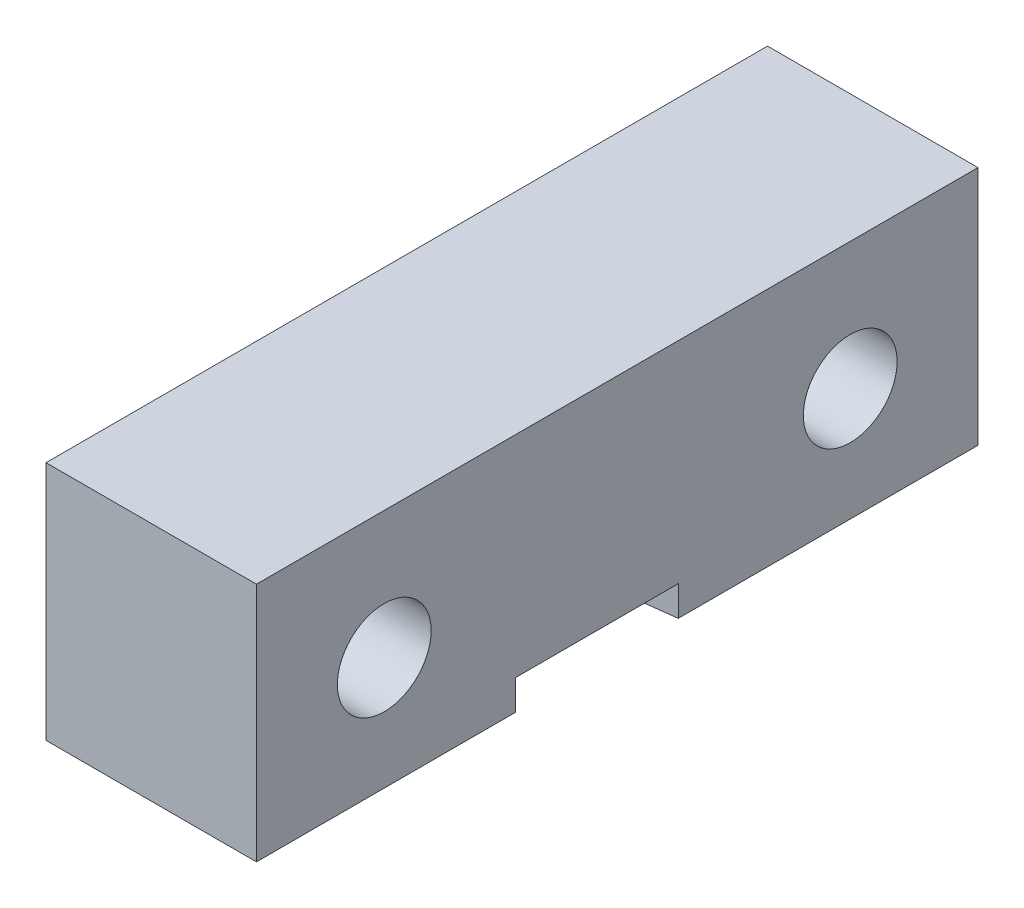
ISO-10303-21;
HEADER;
FILE_DESCRIPTION(('STEP AP214'),'2;1');
FILE_NAME('part.step','',(''),(''),'','','');
FILE_SCHEMA(('AUTOMOTIVE_DESIGN { 1 0 10303 214 1 1 1 1 }'));
ENDSEC;
DATA;
#1=APPLICATION_CONTEXT('core data for automotive mechanical design processes');
#2=APPLICATION_PROTOCOL_DEFINITION('international standard','automotive_design',2000,#1);
#3=PRODUCT_CONTEXT('',#1,'mechanical');
#4=PRODUCT('Part','Part','',(#3));
#5=PRODUCT_RELATED_PRODUCT_CATEGORY('part','',(#4));
#6=PRODUCT_DEFINITION_FORMATION('','',#4);
#7=PRODUCT_DEFINITION_CONTEXT('part definition',#1,'design');
#8=PRODUCT_DEFINITION('design','',#6,#7);
#9=PRODUCT_DEFINITION_SHAPE('','',#8);
#10=(LENGTH_UNIT() NAMED_UNIT(*) SI_UNIT(.MILLI.,.METRE.));
#11=(NAMED_UNIT(*) PLANE_ANGLE_UNIT() SI_UNIT($,.RADIAN.));
#12=(NAMED_UNIT(*) SI_UNIT($,.STERADIAN.) SOLID_ANGLE_UNIT());
#13=UNCERTAINTY_MEASURE_WITH_UNIT(LENGTH_MEASURE(1.E-05),#10,'distance_accuracy_value','');
#14=(GEOMETRIC_REPRESENTATION_CONTEXT(3) GLOBAL_UNCERTAINTY_ASSIGNED_CONTEXT((#13)) GLOBAL_UNIT_ASSIGNED_CONTEXT((#10,
#11,#12)) REPRESENTATION_CONTEXT('',''));
#15=CARTESIAN_POINT('',(0.,0.,0.));
#16=DIRECTION('',(0.,0.,1.));
#17=DIRECTION('',(1.,0.,0.));
#18=AXIS2_PLACEMENT_3D('',#15,#16,#17);
#19=CARTESIAN_POINT('',(-22.226,-1.52399999999999,-49.2125));
#20=DIRECTION('',(1.,0.,0.));
#21=DIRECTION('',(0.,0.,-1.));
#22=AXIS2_PLACEMENT_3D('',#19,#20,#21);
#23=CYLINDRICAL_SURFACE('',#22,6.731);
#24=CARTESIAN_POINT('',(-22.225,-1.52399999999999,-49.2125));
#25=DIRECTION('',(1.,0.,0.));
#26=DIRECTION('',(0.,0.,-1.));
#27=AXIS2_PLACEMENT_3D('',#24,#25,#26);
#28=CIRCLE('',#27,6.731);
#29=CARTESIAN_POINT('',(-22.225,-1.52399999999999,-55.9435));
#30=VERTEX_POINT('',#29);
#31=EDGE_CURVE('E224',#30,#30,#28,.F.);
#32=ORIENTED_EDGE('',*,*,#31,.T.);
#33=EDGE_LOOP('',(#32));
#34=FACE_BOUND('',#33,.T.);
#35=CARTESIAN_POINT('',(-16.383,-1.52399999999999,-49.2125));
#36=DIRECTION('',(1.,0.,0.));
#37=DIRECTION('',(0.,0.,-1.));
#38=AXIS2_PLACEMENT_3D('',#35,#36,#37);
#39=CIRCLE('',#38,6.731);
#40=CARTESIAN_POINT('',(-16.383,-1.52399999999999,-55.9435));
#41=VERTEX_POINT('',#40);
#42=EDGE_CURVE('E228',#41,#41,#39,.F.);
#43=ORIENTED_EDGE('',*,*,#42,.F.);
#44=EDGE_LOOP('',(#43));
#45=FACE_BOUND('',#44,.T.);
#46=ADVANCED_FACE('F56',(#34,#45),#23,.F.);
#47=CARTESIAN_POINT('',(-22.226,-1.52399999999999,49.2125));
#48=DIRECTION('',(1.,0.,0.));
#49=DIRECTION('',(0.,0.,-1.));
#50=AXIS2_PLACEMENT_3D('',#47,#48,#49);
#51=CYLINDRICAL_SURFACE('',#50,6.731);
#52=CARTESIAN_POINT('',(-22.225,-1.52399999999999,49.2125));
#53=DIRECTION('',(1.,0.,0.));
#54=DIRECTION('',(0.,0.,-1.));
#55=AXIS2_PLACEMENT_3D('',#52,#53,#54);
#56=CIRCLE('',#55,6.731);
#57=CARTESIAN_POINT('',(-22.225,-1.52399999999999,42.4815));
#58=VERTEX_POINT('',#57);
#59=EDGE_CURVE('E218',#58,#58,#56,.F.);
#60=ORIENTED_EDGE('',*,*,#59,.T.);
#61=EDGE_LOOP('',(#60));
#62=FACE_BOUND('',#61,.T.);
#63=CARTESIAN_POINT('',(-16.383,-1.52399999999999,49.2125));
#64=DIRECTION('',(1.,0.,0.));
#65=DIRECTION('',(0.,0.,-1.));
#66=AXIS2_PLACEMENT_3D('',#63,#64,#65);
#67=CIRCLE('',#66,6.731);
#68=CARTESIAN_POINT('',(-16.383,-1.52399999999999,42.4815));
#69=VERTEX_POINT('',#68);
#70=EDGE_CURVE('E203',#69,#69,#67,.F.);
#71=ORIENTED_EDGE('',*,*,#70,.F.);
#72=EDGE_LOOP('',(#71));
#73=FACE_BOUND('',#72,.T.);
#74=ADVANCED_FACE('F270',(#62,#73),#51,.F.);
#75=CARTESIAN_POINT('',(-22.225,-25.4,76.2));
#76=DIRECTION('',(1.,0.,0.));
#77=DIRECTION('',(0.,0.,-1.));
#78=AXIS2_PLACEMENT_3D('',#75,#76,#77);
#79=PLANE('',#78);
#80=ORIENTED_EDGE('',*,*,#59,.F.);
#81=EDGE_LOOP('',(#80));
#82=FACE_BOUND('',#81,.T.);
#83=ORIENTED_EDGE('',*,*,#31,.F.);
#84=EDGE_LOOP('',(#83));
#85=FACE_BOUND('',#84,.T.);
#86=DIRECTION('',(0.,-1.,0.));
#87=VECTOR('',#86,1.);
#88=CARTESIAN_POINT('',(-22.225,-25.4,-76.2));
#89=LINE('',#88,#87);
#90=CARTESIAN_POINT('',(-22.225,25.4,-76.2));
#91=VERTEX_POINT('',#90);
#92=CARTESIAN_POINT('',(-22.225,-25.4,-76.2));
#93=VERTEX_POINT('',#92);
#94=EDGE_CURVE('E223',#91,#93,#89,.T.);
#95=ORIENTED_EDGE('',*,*,#94,.T.);
#96=DIRECTION('',(0.,0.,-1.));
#97=VECTOR('',#96,1.);
#98=CARTESIAN_POINT('',(-22.225,-25.4,76.2));
#99=LINE('',#98,#97);
#100=CARTESIAN_POINT('',(-22.225,-25.4,76.2));
#101=VERTEX_POINT('',#100);
#102=EDGE_CURVE('E12',#101,#93,#99,.T.);
#103=ORIENTED_EDGE('',*,*,#102,.F.);
#104=DIRECTION('',(0.,-1.,0.));
#105=VECTOR('',#104,1.);
#106=CARTESIAN_POINT('',(-22.225,-25.4,76.2));
#107=LINE('',#106,#105);
#108=CARTESIAN_POINT('',(-22.225,25.4,76.2));
#109=VERTEX_POINT('',#108);
#110=EDGE_CURVE('E229',#109,#101,#107,.T.);
#111=ORIENTED_EDGE('',*,*,#110,.F.);
#112=DIRECTION('',(0.,0.,-1.));
#113=VECTOR('',#112,1.);
#114=CARTESIAN_POINT('',(-22.225,25.4,76.2));
#115=LINE('',#114,#113);
#116=EDGE_CURVE('E239',#109,#91,#115,.T.);
#117=ORIENTED_EDGE('',*,*,#116,.T.);
#118=EDGE_LOOP('',(#95,#103,#111,#117));
#119=FACE_BOUND('',#118,.T.);
#120=ADVANCED_FACE('F58',(#82,#85,#119),#79,.F.);
#121=CARTESIAN_POINT('',(22.225,-25.4,76.2));
#122=DIRECTION('',(0.,1.,0.));
#123=DIRECTION('',(-1.,0.,0.));
#124=AXIS2_PLACEMENT_3D('',#121,#122,#123);
#125=PLANE('',#124);
#126=DIRECTION('',(0.,0.,-1.));
#127=VECTOR('',#126,1.);
#128=CARTESIAN_POINT('',(22.225,-25.4,76.2));
#129=LINE('',#128,#127);
#130=CARTESIAN_POINT('',(22.225,-25.4,-12.8902412442228));
#131=VERTEX_POINT('',#130);
#132=CARTESIAN_POINT('',(22.225,-25.4,-76.2));
#133=VERTEX_POINT('',#132);
#134=EDGE_CURVE('E257',#131,#133,#129,.T.);
#135=ORIENTED_EDGE('',*,*,#134,.F.);
#136=DIRECTION('',(0.992381216435197,0.,-0.123205199835875));
#137=VECTOR('',#136,1.);
#138=CARTESIAN_POINT('',(22.225,-25.4,-12.8902412442228));
#139=LINE('',#138,#137);
#140=CARTESIAN_POINT('',(0.94724636356612,-25.4,-10.248585149348));
#141=VERTEX_POINT('',#140);
#142=EDGE_CURVE('E169',#141,#131,#139,.T.);
#143=ORIENTED_EDGE('',*,*,#142,.F.);
#144=CARTESIAN_POINT('',(2.75604654339657,-25.4,4.32076196538043));
#145=DIRECTION('',(0.,-1.,0.));
#146=DIRECTION('',(1.,0.,0.));
#147=AXIS2_PLACEMENT_3D('',#144,#145,#146);
#148=CIRCLE('',#147,14.6812);
#149=CARTESIAN_POINT('',(0.947246363566016,-25.4,18.8901090801088));
#150=VERTEX_POINT('',#149);
#151=EDGE_CURVE('E175',#150,#141,#148,.T.);
#152=ORIENTED_EDGE('',*,*,#151,.F.);
#153=DIRECTION('',(-0.992381216435197,0.,-0.123205199835882));
#154=VECTOR('',#153,1.);
#155=CARTESIAN_POINT('',(22.225,-25.4,21.5317651749838));
#156=LINE('',#155,#154);
#157=CARTESIAN_POINT('',(22.225,-25.4,21.5317651749838));
#158=VERTEX_POINT('',#157);
#159=EDGE_CURVE('E150',#158,#150,#156,.T.);
#160=ORIENTED_EDGE('',*,*,#159,.F.);
#161=CARTESIAN_POINT('',(22.225,-25.4,76.2));
#162=VERTEX_POINT('',#161);
#163=EDGE_CURVE('E66',#162,#158,#129,.T.);
#164=ORIENTED_EDGE('',*,*,#163,.F.);
#165=DIRECTION('',(1.,0.,0.));
#166=VECTOR('',#165,1.);
#167=CARTESIAN_POINT('',(22.225,-25.4,76.2));
#168=LINE('',#167,#166);
#169=EDGE_CURVE('E112',#101,#162,#168,.T.);
#170=ORIENTED_EDGE('',*,*,#169,.F.);
#171=ORIENTED_EDGE('',*,*,#102,.T.);
#172=DIRECTION('',(1.,0.,0.));
#173=VECTOR('',#172,1.);
#174=CARTESIAN_POINT('',(22.225,-25.4,-76.2));
#175=LINE('',#174,#173);
#176=EDGE_CURVE('E243',#93,#133,#175,.T.);
#177=ORIENTED_EDGE('',*,*,#176,.T.);
#178=EDGE_LOOP('',(#135,#143,#152,#160,#164,#170,#171,#177));
#179=FACE_BOUND('',#178,.T.);
#180=ADVANCED_FACE('F294',(#179),#125,.F.);
#181=CARTESIAN_POINT('',(22.225,-25.4,76.2));
#182=DIRECTION('',(-1.,0.,0.));
#183=DIRECTION('',(0.,0.,1.));
#184=AXIS2_PLACEMENT_3D('',#181,#182,#183);
#185=PLANE('',#184);
#186=CARTESIAN_POINT('',(22.225,-1.52399999999999,49.2125));
#187=DIRECTION('',(1.,0.,0.));
#188=DIRECTION('',(0.,0.,-1.));
#189=AXIS2_PLACEMENT_3D('',#186,#187,#188);
#190=CIRCLE('',#189,9.906);
#191=CARTESIAN_POINT('',(22.225,-1.52399999999999,39.3065));
#192=VERTEX_POINT('',#191);
#193=EDGE_CURVE('E204',#192,#192,#190,.T.);
#194=ORIENTED_EDGE('',*,*,#193,.F.);
#195=EDGE_LOOP('',(#194));
#196=FACE_BOUND('',#195,.T.);
#197=CARTESIAN_POINT('',(22.225,-1.52399999999999,-49.2125));
#198=DIRECTION('',(1.,0.,0.));
#199=DIRECTION('',(0.,0.,-1.));
#200=AXIS2_PLACEMENT_3D('',#197,#198,#199);
#201=CIRCLE('',#200,9.906);
#202=CARTESIAN_POINT('',(22.225,-1.52399999999999,-59.1185));
#203=VERTEX_POINT('',#202);
#204=EDGE_CURVE('E216',#203,#203,#201,.T.);
#205=ORIENTED_EDGE('',*,*,#204,.F.);
#206=EDGE_LOOP('',(#205));
#207=FACE_BOUND('',#206,.T.);
#208=DIRECTION('',(0.,0.,1.));
#209=VECTOR('',#208,1.);
#210=CARTESIAN_POINT('',(22.225,-19.05,-12.8902412442228));
#211=LINE('',#210,#209);
#212=CARTESIAN_POINT('',(22.225,-19.05,-12.8902412442228));
#213=VERTEX_POINT('',#212);
#214=CARTESIAN_POINT('',(22.225,-19.05,21.5317651749838));
#215=VERTEX_POINT('',#214);
#216=EDGE_CURVE('E157',#213,#215,#211,.T.);
#217=ORIENTED_EDGE('',*,*,#216,.F.);
#218=DIRECTION('',(0.,-1.,0.));
#219=VECTOR('',#218,1.);
#220=CARTESIAN_POINT('',(22.225,-19.05,-12.8902412442228));
#221=LINE('',#220,#219);
#222=EDGE_CURVE('E160',#213,#131,#221,.T.);
#223=ORIENTED_EDGE('',*,*,#222,.T.);
#224=ORIENTED_EDGE('',*,*,#134,.T.);
#225=DIRECTION('',(0.,1.,0.));
#226=VECTOR('',#225,1.);
#227=CARTESIAN_POINT('',(22.225,-25.4,-76.2));
#228=LINE('',#227,#226);
#229=CARTESIAN_POINT('',(22.225,25.4,-76.2));
#230=VERTEX_POINT('',#229);
#231=EDGE_CURVE('E247',#133,#230,#228,.T.);
#232=ORIENTED_EDGE('',*,*,#231,.T.);
#233=DIRECTION('',(0.,0.,-1.));
#234=VECTOR('',#233,1.);
#235=CARTESIAN_POINT('',(22.225,25.4,76.2));
#236=LINE('',#235,#234);
#237=CARTESIAN_POINT('',(22.225,25.4,76.2));
#238=VERTEX_POINT('',#237);
#239=EDGE_CURVE('E254',#238,#230,#236,.T.);
#240=ORIENTED_EDGE('',*,*,#239,.F.);
#241=DIRECTION('',(0.,1.,0.));
#242=VECTOR('',#241,1.);
#243=CARTESIAN_POINT('',(22.225,-25.4,76.2));
#244=LINE('',#243,#242);
#245=EDGE_CURVE('E234',#162,#238,#244,.T.);
#246=ORIENTED_EDGE('',*,*,#245,.F.);
#247=ORIENTED_EDGE('',*,*,#163,.T.);
#248=DIRECTION('',(0.,-1.,0.));
#249=VECTOR('',#248,1.);
#250=CARTESIAN_POINT('',(22.225,-19.05,21.5317651749838));
#251=LINE('',#250,#249);
#252=EDGE_CURVE('E153',#215,#158,#251,.T.);
#253=ORIENTED_EDGE('',*,*,#252,.F.);
#254=EDGE_LOOP('',(#217,#223,#224,#232,#240,#246,#247,#253));
#255=FACE_BOUND('',#254,.T.);
#256=ADVANCED_FACE('F292',(#196,#207,#255),#185,.F.);
#257=CARTESIAN_POINT('',(22.225,25.4,76.2));
#258=DIRECTION('',(0.,-1.,0.));
#259=DIRECTION('',(1.,0.,0.));
#260=AXIS2_PLACEMENT_3D('',#257,#258,#259);
#261=PLANE('',#260);
#262=DIRECTION('',(-1.,0.,0.));
#263=VECTOR('',#262,1.);
#264=CARTESIAN_POINT('',(22.225,25.4,-76.2));
#265=LINE('',#264,#263);
#266=EDGE_CURVE('E105',#230,#91,#265,.T.);
#267=ORIENTED_EDGE('',*,*,#266,.T.);
#268=ORIENTED_EDGE('',*,*,#116,.F.);
#269=DIRECTION('',(-1.,0.,0.));
#270=VECTOR('',#269,1.);
#271=CARTESIAN_POINT('',(22.225,25.4,76.2));
#272=LINE('',#271,#270);
#273=EDGE_CURVE('E83',#238,#109,#272,.T.);
#274=ORIENTED_EDGE('',*,*,#273,.F.);
#275=ORIENTED_EDGE('',*,*,#239,.T.);
#276=EDGE_LOOP('',(#267,#268,#274,#275));
#277=FACE_BOUND('',#276,.T.);
#278=ADVANCED_FACE('F285',(#277),#261,.F.);
#279=CARTESIAN_POINT('',(0.,0.,76.2));
#280=DIRECTION('',(0.,0.,1.));
#281=DIRECTION('',(1.,0.,0.));
#282=AXIS2_PLACEMENT_3D('',#279,#280,#281);
#283=PLANE('',#282);
#284=ORIENTED_EDGE('',*,*,#110,.T.);
#285=ORIENTED_EDGE('',*,*,#169,.T.);
#286=ORIENTED_EDGE('',*,*,#245,.T.);
#287=ORIENTED_EDGE('',*,*,#273,.T.);
#288=EDGE_LOOP('',(#284,#285,#286,#287));
#289=FACE_BOUND('',#288,.T.);
#290=ADVANCED_FACE('F281',(#289),#283,.T.);
#291=CARTESIAN_POINT('',(0.,0.,-76.2));
#292=DIRECTION('',(0.,0.,1.));
#293=DIRECTION('',(1.,0.,0.));
#294=AXIS2_PLACEMENT_3D('',#291,#292,#293);
#295=PLANE('',#294);
#296=ORIENTED_EDGE('',*,*,#94,.F.);
#297=ORIENTED_EDGE('',*,*,#266,.F.);
#298=ORIENTED_EDGE('',*,*,#231,.F.);
#299=ORIENTED_EDGE('',*,*,#176,.F.);
#300=EDGE_LOOP('',(#296,#297,#298,#299));
#301=FACE_BOUND('',#300,.T.);
#302=ADVANCED_FACE('F284',(#301),#295,.F.);
#303=CARTESIAN_POINT('',(-16.383,-1.52399999999999,49.2125));
#304=DIRECTION('',(1.,0.,0.));
#305=DIRECTION('',(0.,0.,-1.));
#306=AXIS2_PLACEMENT_3D('',#303,#304,#305);
#307=PLANE('',#306);
#308=CARTESIAN_POINT('',(-16.383,-1.52399999999999,49.2125));
#309=DIRECTION('',(1.,0.,0.));
#310=DIRECTION('',(0.,0.,-1.));
#311=AXIS2_PLACEMENT_3D('',#308,#309,#310);
#312=CIRCLE('',#311,9.906);
#313=CARTESIAN_POINT('',(-16.383,-1.52399999999999,39.3065));
#314=VERTEX_POINT('',#313);
#315=EDGE_CURVE('E199',#314,#314,#312,.T.);
#316=ORIENTED_EDGE('',*,*,#315,.T.);
#317=EDGE_LOOP('',(#316));
#318=FACE_BOUND('',#317,.T.);
#319=ORIENTED_EDGE('',*,*,#70,.T.);
#320=EDGE_LOOP('',(#319));
#321=FACE_BOUND('',#320,.T.);
#322=ADVANCED_FACE('F288',(#318,#321),#307,.T.);
#323=CARTESIAN_POINT('',(-16.383,-1.52399999999999,49.2125));
#324=DIRECTION('',(1.,0.,0.));
#325=DIRECTION('',(0.,0.,-1.));
#326=AXIS2_PLACEMENT_3D('',#323,#324,#325);
#327=CYLINDRICAL_SURFACE('',#326,9.906);
#328=ORIENTED_EDGE('',*,*,#315,.F.);
#329=EDGE_LOOP('',(#328));
#330=FACE_BOUND('',#329,.T.);
#331=ORIENTED_EDGE('',*,*,#193,.T.);
#332=EDGE_LOOP('',(#331));
#333=FACE_BOUND('',#332,.T.);
#334=ADVANCED_FACE('F358',(#330,#333),#327,.F.);
#335=CARTESIAN_POINT('',(-16.383,-1.52399999999999,-49.2125));
#336=DIRECTION('',(1.,0.,0.));
#337=DIRECTION('',(0.,0.,-1.));
#338=AXIS2_PLACEMENT_3D('',#335,#336,#337);
#339=PLANE('',#338);
#340=CARTESIAN_POINT('',(-16.383,-1.52399999999999,-49.2125));
#341=DIRECTION('',(1.,0.,0.));
#342=DIRECTION('',(0.,0.,-1.));
#343=AXIS2_PLACEMENT_3D('',#340,#341,#342);
#344=CIRCLE('',#343,9.906);
#345=CARTESIAN_POINT('',(-16.383,-1.52399999999999,-59.1185));
#346=VERTEX_POINT('',#345);
#347=EDGE_CURVE('E211',#346,#346,#344,.T.);
#348=ORIENTED_EDGE('',*,*,#347,.T.);
#349=EDGE_LOOP('',(#348));
#350=FACE_BOUND('',#349,.T.);
#351=ORIENTED_EDGE('',*,*,#42,.T.);
#352=EDGE_LOOP('',(#351));
#353=FACE_BOUND('',#352,.T.);
#354=ADVANCED_FACE('F267',(#350,#353),#339,.T.);
#355=CARTESIAN_POINT('',(-16.383,-1.52399999999999,-49.2125));
#356=DIRECTION('',(1.,0.,0.));
#357=DIRECTION('',(0.,0.,-1.));
#358=AXIS2_PLACEMENT_3D('',#355,#356,#357);
#359=CYLINDRICAL_SURFACE('',#358,9.906);
#360=ORIENTED_EDGE('',*,*,#347,.F.);
#361=EDGE_LOOP('',(#360));
#362=FACE_BOUND('',#361,.T.);
#363=ORIENTED_EDGE('',*,*,#204,.T.);
#364=EDGE_LOOP('',(#363));
#365=FACE_BOUND('',#364,.T.);
#366=ADVANCED_FACE('F355',(#362,#365),#359,.F.);
#367=CARTESIAN_POINT('',(22.225,-19.05,-12.8902412442228));
#368=DIRECTION('',(-0.123205199835875,0.,-0.992381216435197));
#369=DIRECTION('',(-0.992381216435198,0.,0.123205199835875));
#370=AXIS2_PLACEMENT_3D('',#367,#368,#369);
#371=PLANE('',#370);
#372=ORIENTED_EDGE('',*,*,#142,.T.);
#373=ORIENTED_EDGE('',*,*,#222,.F.);
#374=DIRECTION('',(0.992381216435197,0.,-0.123205199835875));
#375=VECTOR('',#374,1.);
#376=CARTESIAN_POINT('',(22.225,-19.05,-12.8902412442228));
#377=LINE('',#376,#375);
#378=CARTESIAN_POINT('',(0.947246363566119,-19.05,-10.248585149348));
#379=VERTEX_POINT('',#378);
#380=EDGE_CURVE('E74',#379,#213,#377,.T.);
#381=ORIENTED_EDGE('',*,*,#380,.F.);
#382=DIRECTION('',(0.,-1.,0.));
#383=VECTOR('',#382,1.);
#384=CARTESIAN_POINT('',(0.947246363566119,-19.05,-10.248585149348));
#385=LINE('',#384,#383);
#386=EDGE_CURVE('E141',#379,#141,#385,.T.);
#387=ORIENTED_EDGE('',*,*,#386,.T.);
#388=EDGE_LOOP('',(#372,#373,#381,#387));
#389=FACE_BOUND('',#388,.T.);
#390=ADVANCED_FACE('F318',(#389),#371,.F.);
#391=CARTESIAN_POINT('',(2.75604654339657,-19.05,4.32076196538043));
#392=DIRECTION('',(0.,-1.,0.));
#393=DIRECTION('',(1.,0.,0.));
#394=AXIS2_PLACEMENT_3D('',#391,#392,#393);
#395=CYLINDRICAL_SURFACE('',#394,14.6812);
#396=ORIENTED_EDGE('',*,*,#151,.T.);
#397=ORIENTED_EDGE('',*,*,#386,.F.);
#398=CARTESIAN_POINT('',(2.7560465433966,-19.05,4.32076196538063));
#399=DIRECTION('',(0.,-1.,0.));
#400=DIRECTION('',(1.,0.,0.));
#401=AXIS2_PLACEMENT_3D('',#398,#399,#400);
#402=CIRCLE('',#401,14.6812000000001);
#403=CARTESIAN_POINT('',(0.947246363565982,-19.05,18.8901090801091));
#404=VERTEX_POINT('',#403);
#405=EDGE_CURVE('E134',#379,#404,#402,.T.);
#406=ORIENTED_EDGE('',*,*,#405,.T.);
#407=DIRECTION('',(0.,-1.,0.));
#408=VECTOR('',#407,1.);
#409=CARTESIAN_POINT('',(0.947246363566015,-19.05,18.8901090801088));
#410=LINE('',#409,#408);
#411=EDGE_CURVE('E139',#404,#150,#410,.T.);
#412=ORIENTED_EDGE('',*,*,#411,.T.);
#413=EDGE_LOOP('',(#396,#397,#406,#412));
#414=FACE_BOUND('',#413,.T.);
#415=CARTESIAN_POINT('',(2.7560465433966,-17.4625,4.32076196538063));
#416=DIRECTION('',(0.,-1.,0.));
#417=DIRECTION('',(1.,0.,0.));
#418=AXIS2_PLACEMENT_3D('',#415,#416,#417);
#419=CIRCLE('',#418,14.6812000000001);
#420=CARTESIAN_POINT('',(17.4372465433967,-17.4625,4.32076196538063));
#421=VERTEX_POINT('',#420);
#422=EDGE_CURVE('E144',#421,#421,#419,.T.);
#423=ORIENTED_EDGE('',*,*,#422,.F.);
#424=EDGE_LOOP('',(#423));
#425=FACE_BOUND('',#424,.T.);
#426=ADVANCED_FACE('F137',(#414,#425),#395,.F.);
#427=CARTESIAN_POINT('',(22.225,-19.05,21.5317651749838));
#428=DIRECTION('',(-0.123205199835882,0.,0.992381216435196));
#429=DIRECTION('',(0.992381216435197,0.,0.123205199835882));
#430=AXIS2_PLACEMENT_3D('',#427,#428,#429);
#431=PLANE('',#430);
#432=ORIENTED_EDGE('',*,*,#159,.T.);
#433=ORIENTED_EDGE('',*,*,#411,.F.);
#434=DIRECTION('',(-0.992381216435197,0.,-0.123205199835882));
#435=VECTOR('',#434,1.);
#436=CARTESIAN_POINT('',(22.225,-19.05,21.5317651749838));
#437=LINE('',#436,#435);
#438=EDGE_CURVE('E148',#215,#404,#437,.T.);
#439=ORIENTED_EDGE('',*,*,#438,.F.);
#440=ORIENTED_EDGE('',*,*,#252,.T.);
#441=EDGE_LOOP('',(#432,#433,#439,#440));
#442=FACE_BOUND('',#441,.T.);
#443=ADVANCED_FACE('F147',(#442),#431,.F.);
#444=CARTESIAN_POINT('',(2.75604654339657,-19.05,4.32076196538043));
#445=DIRECTION('',(0.,-1.,0.));
#446=DIRECTION('',(1.,0.,0.));
#447=AXIS2_PLACEMENT_3D('',#444,#445,#446);
#448=PLANE('',#447);
#449=ORIENTED_EDGE('',*,*,#405,.F.);
#450=ORIENTED_EDGE('',*,*,#380,.T.);
#451=ORIENTED_EDGE('',*,*,#216,.T.);
#452=ORIENTED_EDGE('',*,*,#438,.T.);
#453=EDGE_LOOP('',(#449,#450,#451,#452));
#454=FACE_BOUND('',#453,.T.);
#455=ADVANCED_FACE('F155',(#454),#448,.T.);
#456=CARTESIAN_POINT('',(2.7560465433966,-17.4625,4.32076196538063));
#457=DIRECTION('',(0.,-1.,0.));
#458=DIRECTION('',(1.,0.,0.));
#459=AXIS2_PLACEMENT_3D('',#456,#457,#458);
#460=PLANE('',#459);
#461=ORIENTED_EDGE('',*,*,#422,.T.);
#462=EDGE_LOOP('',(#461));
#463=FACE_BOUND('',#462,.T.);
#464=CARTESIAN_POINT('',(2.7560465433966,-17.4625,4.32076196538063));
#465=DIRECTION('',(0.,-1.,0.));
#466=DIRECTION('',(1.,0.,0.));
#467=AXIS2_PLACEMENT_3D('',#464,#465,#466);
#468=CIRCLE('',#467,12.0142);
#469=CARTESIAN_POINT('',(14.7702465433966,-17.4625,4.32076196538063));
#470=VERTEX_POINT('',#469);
#471=EDGE_CURVE('E60',#470,#470,#468,.F.);
#472=ORIENTED_EDGE('',*,*,#471,.T.);
#473=EDGE_LOOP('',(#472));
#474=FACE_BOUND('',#473,.T.);
#475=ADVANCED_FACE('F333',(#463,#474),#460,.T.);
#476=CARTESIAN_POINT('',(2.7560465433966,-15.24,4.32076196538063));
#477=DIRECTION('',(0.,-1.,0.));
#478=DIRECTION('',(1.,0.,0.));
#479=AXIS2_PLACEMENT_3D('',#476,#477,#478);
#480=PLANE('',#479);
#481=CARTESIAN_POINT('',(2.7560465433966,-15.24,4.32076196538063));
#482=DIRECTION('',(0.,-1.,0.));
#483=DIRECTION('',(1.,0.,0.));
#484=AXIS2_PLACEMENT_3D('',#481,#482,#483);
#485=CIRCLE('',#484,12.0142);
#486=CARTESIAN_POINT('',(14.7702465433966,-15.24,4.32076196538063));
#487=VERTEX_POINT('',#486);
#488=EDGE_CURVE('E172',#487,#487,#485,.T.);
#489=ORIENTED_EDGE('',*,*,#488,.T.);
#490=EDGE_LOOP('',(#489));
#491=FACE_BOUND('',#490,.T.);
#492=ADVANCED_FACE('F337',(#491),#480,.T.);
#493=CARTESIAN_POINT('',(2.7560465433966,-15.24,4.32076196538063));
#494=DIRECTION('',(0.,-1.,0.));
#495=DIRECTION('',(1.,0.,0.));
#496=AXIS2_PLACEMENT_3D('',#493,#494,#495);
#497=CYLINDRICAL_SURFACE('',#496,12.0142);
#498=CARTESIAN_POINT('',(14.7702465433966,-15.24,4.32076196538063));
#499=CARTESIAN_POINT('',(14.7702465433966,-15.2631510416667,4.32076196538063));
#500=CARTESIAN_POINT('',(14.7702465433966,-15.2863020833333,4.32076196538063));
#501=CARTESIAN_POINT('',(14.7702465433966,-15.3326041666667,4.32076196538063));
#502=CARTESIAN_POINT('',(14.7702465433966,-15.3557552083333,4.32076196538063));
#503=CARTESIAN_POINT('',(14.7702465433966,-15.4020572916667,4.32076196538063));
#504=CARTESIAN_POINT('',(14.7702465433966,-15.4252083333333,4.32076196538063));
#505=CARTESIAN_POINT('',(14.7702465433966,-15.4715104166667,4.32076196538063));
#506=CARTESIAN_POINT('',(14.7702465433966,-15.4946614583333,4.32076196538063));
#507=CARTESIAN_POINT('',(14.7702465433966,-15.5409635416667,4.32076196538063));
#508=CARTESIAN_POINT('',(14.7702465433966,-15.5641145833333,4.32076196538063));
#509=CARTESIAN_POINT('',(14.7702465433966,-15.6104166666667,4.32076196538063));
#510=CARTESIAN_POINT('',(14.7702465433966,-15.6335677083333,4.32076196538063));
#511=CARTESIAN_POINT('',(14.7702465433966,-15.6798697916667,4.32076196538063));
#512=CARTESIAN_POINT('',(14.7702465433966,-15.7030208333333,4.32076196538063));
#513=CARTESIAN_POINT('',(14.7702465433966,-15.7493229166667,4.32076196538063));
#514=CARTESIAN_POINT('',(14.7702465433966,-15.7724739583333,4.32076196538063));
#515=CARTESIAN_POINT('',(14.7702465433966,-15.8187760416667,4.32076196538063));
#516=CARTESIAN_POINT('',(14.7702465433966,-15.8419270833333,4.32076196538063));
#517=CARTESIAN_POINT('',(14.7702465433966,-15.8882291666667,4.32076196538063));
#518=CARTESIAN_POINT('',(14.7702465433966,-15.9113802083333,4.32076196538063));
#519=CARTESIAN_POINT('',(14.7702465433966,-15.9576822916667,4.32076196538063));
#520=CARTESIAN_POINT('',(14.7702465433966,-15.9808333333333,4.32076196538063));
#521=CARTESIAN_POINT('',(14.7702465433966,-16.0271354166667,4.32076196538063));
#522=CARTESIAN_POINT('',(14.7702465433966,-16.0502864583333,4.32076196538063));
#523=CARTESIAN_POINT('',(14.7702465433966,-16.0965885416667,4.32076196538063));
#524=CARTESIAN_POINT('',(14.7702465433966,-16.1197395833333,4.32076196538063));
#525=CARTESIAN_POINT('',(14.7702465433966,-16.1660416666667,4.32076196538063));
#526=CARTESIAN_POINT('',(14.7702465433966,-16.1891927083333,4.32076196538063));
#527=CARTESIAN_POINT('',(14.7702465433966,-16.2354947916667,4.32076196538063));
#528=CARTESIAN_POINT('',(14.7702465433966,-16.2586458333333,4.32076196538063));
#529=CARTESIAN_POINT('',(14.7702465433966,-16.3049479166667,4.32076196538063));
#530=CARTESIAN_POINT('',(14.7702465433966,-16.3280989583333,4.32076196538063));
#531=CARTESIAN_POINT('',(14.7702465433966,-16.3744010416667,4.32076196538063));
#532=CARTESIAN_POINT('',(14.7702465433966,-16.3975520833333,4.32076196538063));
#533=CARTESIAN_POINT('',(14.7702465433966,-16.4438541666667,4.32076196538063));
#534=CARTESIAN_POINT('',(14.7702465433966,-16.4670052083333,4.32076196538063));
#535=CARTESIAN_POINT('',(14.7702465433966,-16.5133072916667,4.32076196538063));
#536=CARTESIAN_POINT('',(14.7702465433966,-16.5364583333333,4.32076196538063));
#537=CARTESIAN_POINT('',(14.7702465433966,-16.5827604166667,4.32076196538063));
#538=CARTESIAN_POINT('',(14.7702465433966,-16.6059114583333,4.32076196538063));
#539=CARTESIAN_POINT('',(14.7702465433966,-16.6522135416667,4.32076196538063));
#540=CARTESIAN_POINT('',(14.7702465433966,-16.6753645833333,4.32076196538063));
#541=CARTESIAN_POINT('',(14.7702465433966,-16.7216666666667,4.32076196538063));
#542=CARTESIAN_POINT('',(14.7702465433966,-16.7448177083333,4.32076196538063));
#543=CARTESIAN_POINT('',(14.7702465433966,-16.7911197916667,4.32076196538063));
#544=CARTESIAN_POINT('',(14.7702465433966,-16.8142708333333,4.32076196538063));
#545=CARTESIAN_POINT('',(14.7702465433966,-16.8605729166667,4.32076196538063));
#546=CARTESIAN_POINT('',(14.7702465433966,-16.8837239583333,4.32076196538063));
#547=CARTESIAN_POINT('',(14.7702465433966,-16.9300260416667,4.32076196538063));
#548=CARTESIAN_POINT('',(14.7702465433966,-16.9531770833333,4.32076196538063));
#549=CARTESIAN_POINT('',(14.7702465433966,-16.9994791666667,4.32076196538063));
#550=CARTESIAN_POINT('',(14.7702465433966,-17.0226302083333,4.32076196538063));
#551=CARTESIAN_POINT('',(14.7702465433966,-17.0689322916667,4.32076196538063));
#552=CARTESIAN_POINT('',(14.7702465433966,-17.0920833333333,4.32076196538063));
#553=CARTESIAN_POINT('',(14.7702465433966,-17.1383854166667,4.32076196538063));
#554=CARTESIAN_POINT('',(14.7702465433966,-17.1615364583333,4.32076196538063));
#555=CARTESIAN_POINT('',(14.7702465433966,-17.2078385416667,4.32076196538063));
#556=CARTESIAN_POINT('',(14.7702465433966,-17.2309895833333,4.32076196538063));
#557=CARTESIAN_POINT('',(14.7702465433966,-17.2772916666667,4.32076196538063));
#558=CARTESIAN_POINT('',(14.7702465433966,-17.3004427083333,4.32076196538063));
#559=CARTESIAN_POINT('',(14.7702465433966,-17.3467447916667,4.32076196538063));
#560=CARTESIAN_POINT('',(14.7702465433966,-17.3698958333333,4.32076196538063));
#561=CARTESIAN_POINT('',(14.7702465433966,-17.4161979166667,4.32076196538063));
#562=CARTESIAN_POINT('',(14.7702465433966,-17.4393489583333,4.32076196538063));
#563=CARTESIAN_POINT('',(14.7702465433966,-17.4625,4.32076196538063));
#564=B_SPLINE_CURVE_WITH_KNOTS('',3,(#498,#499,#500,#501,#502,#503,#504,#505,#506,#507,#508,
#509,#510,#511,#512,#513,#514,#515,#516,#517,#518,#519,#520,#521,#522,#523,#524,#525,#526,#527,
#528,#529,#530,#531,#532,#533,#534,#535,#536,#537,#538,#539,#540,#541,#542,#543,#544,#545,#546,
#547,#548,#549,#550,#551,#552,#553,#554,#555,#556,#557,#558,#559,#560,#561,#562,#563),
.UNSPECIFIED.,.F.,.F.,(4,2,2,2,2,2,2,2,2,2,2,2,2,2,2,2,2,2,2,2,2,2,2,2,2,2,2,2,2,2,2,2,4),(0.,
0.0694531249999988,0.138906249999999,0.208359375,0.277812499999999,0.347265624999999,0.41671875,
0.486171875,0.555625000000001,0.625078125000001,0.694531249999998,0.763984374999999,
0.833437499999999,0.902890625,0.97234375,1.041796875,1.11125,1.180703125,1.25015625,1.319609375,
1.3890625,1.458515625,1.52796875,1.597421875,1.666875,1.736328125,1.80578125,1.875234375,
1.9446875,2.014140625,2.08359375,2.153046875,2.2225),.UNSPECIFIED.);
#565=EDGE_CURVE('BSEAM335',#487,#470,#564,.T.);
#566=ORIENTED_EDGE('',*,*,#488,.F.);
#567=ORIENTED_EDGE('',*,*,#471,.F.);
#568=ORIENTED_EDGE('',*,*,#565,.T.);
#569=ORIENTED_EDGE('',*,*,#565,.F.);
#570=EDGE_LOOP('',(#566,#568,#567,#569));
#571=FACE_BOUND('',#570,.T.);
#572=ADVANCED_FACE('F335',(#571),#497,.F.);
#573=CLOSED_SHELL('',(#46,#74,#120,#180,#256,#278,#290,#302,#322,#334,#354,#366,#390,#426,#443,
#455,#475,#492,#572));
#574=MANIFOLD_SOLID_BREP('B2',#573);
#575=ADVANCED_BREP_SHAPE_REPRESENTATION('',(#18,#574),#14);
#576=SHAPE_DEFINITION_REPRESENTATION(#9,#575);
ENDSEC;
END-ISO-10303-21;
